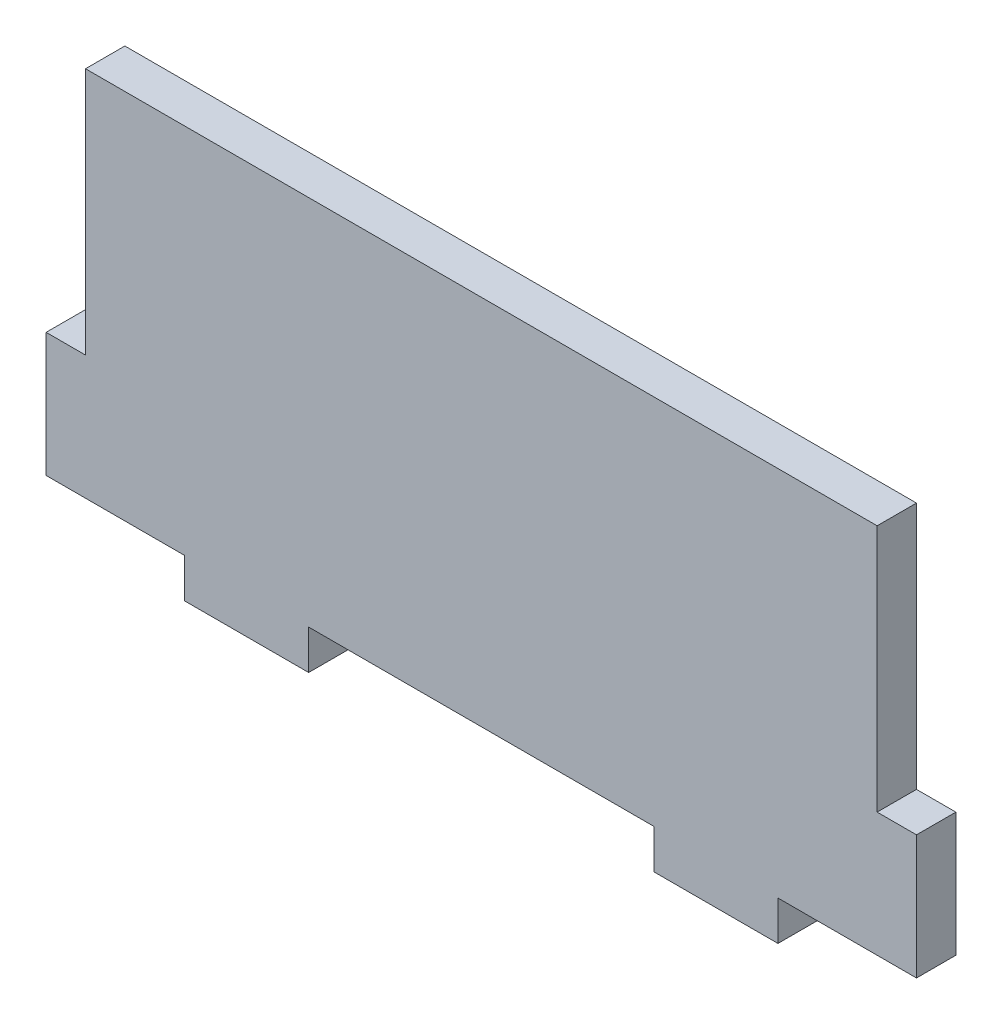
ISO-10303-21;
HEADER;
FILE_DESCRIPTION(('STEP AP214'),'2;1');
FILE_NAME('part.step','',(''),(''),'','','');
FILE_SCHEMA(('AUTOMOTIVE_DESIGN { 1 0 10303 214 1 1 1 1 }'));
ENDSEC;
DATA;
#1=APPLICATION_CONTEXT('core data for automotive mechanical design processes');
#2=APPLICATION_PROTOCOL_DEFINITION('international standard','automotive_design',2000,#1);
#3=PRODUCT_CONTEXT('',#1,'mechanical');
#4=PRODUCT('Part','Part','',(#3));
#5=PRODUCT_RELATED_PRODUCT_CATEGORY('part','',(#4));
#6=PRODUCT_DEFINITION_FORMATION('','',#4);
#7=PRODUCT_DEFINITION_CONTEXT('part definition',#1,'design');
#8=PRODUCT_DEFINITION('design','',#6,#7);
#9=PRODUCT_DEFINITION_SHAPE('','',#8);
#10=(LENGTH_UNIT() NAMED_UNIT(*) SI_UNIT(.MILLI.,.METRE.));
#11=(NAMED_UNIT(*) PLANE_ANGLE_UNIT() SI_UNIT($,.RADIAN.));
#12=(NAMED_UNIT(*) SI_UNIT($,.STERADIAN.) SOLID_ANGLE_UNIT());
#13=UNCERTAINTY_MEASURE_WITH_UNIT(LENGTH_MEASURE(1.E-05),#10,'distance_accuracy_value','');
#14=(GEOMETRIC_REPRESENTATION_CONTEXT(3) GLOBAL_UNCERTAINTY_ASSIGNED_CONTEXT((#13)) GLOBAL_UNIT_ASSIGNED_CONTEXT((#10,
#11,#12)) REPRESENTATION_CONTEXT('',''));
#15=CARTESIAN_POINT('',(0.,0.,0.));
#16=DIRECTION('',(0.,0.,1.));
#17=DIRECTION('',(1.,0.,0.));
#18=AXIS2_PLACEMENT_3D('',#15,#16,#17);
#19=CARTESIAN_POINT('',(0.,-60.,12.7));
#20=DIRECTION('',(0.,1.,0.));
#21=DIRECTION('',(0.,0.,1.));
#22=AXIS2_PLACEMENT_3D('',#19,#20,#21);
#23=PLANE('',#22);
#24=DIRECTION('',(1.,0.,0.));
#25=VECTOR('',#24,1.);
#26=CARTESIAN_POINT('',(0.,-60.,0.));
#27=LINE('',#26,#25);
#28=CARTESIAN_POINT('',(-140.4,-60.,0.));
#29=VERTEX_POINT('',#28);
#30=CARTESIAN_POINT('',(-95.7,-60.,0.));
#31=VERTEX_POINT('',#30);
#32=EDGE_CURVE('E188',#29,#31,#27,.T.);
#33=ORIENTED_EDGE('',*,*,#32,.T.);
#34=DIRECTION('',(0.,0.,-1.));
#35=VECTOR('',#34,1.);
#36=CARTESIAN_POINT('',(-95.7,-60.,12.7));
#37=LINE('',#36,#35);
#38=CARTESIAN_POINT('',(-95.7,-60.,12.7));
#39=VERTEX_POINT('',#38);
#40=EDGE_CURVE('E11',#39,#31,#37,.T.);
#41=ORIENTED_EDGE('',*,*,#40,.F.);
#42=DIRECTION('',(1.,0.,0.));
#43=VECTOR('',#42,1.);
#44=CARTESIAN_POINT('',(0.,-60.,12.7));
#45=LINE('',#44,#43);
#46=CARTESIAN_POINT('',(-140.4,-60.,12.7));
#47=VERTEX_POINT('',#46);
#48=EDGE_CURVE('E228',#47,#39,#45,.T.);
#49=ORIENTED_EDGE('',*,*,#48,.F.);
#50=DIRECTION('',(0.,0.,-1.));
#51=VECTOR('',#50,1.);
#52=CARTESIAN_POINT('',(-140.4,-60.,12.7));
#53=LINE('',#52,#51);
#54=EDGE_CURVE('E58',#47,#29,#53,.T.);
#55=ORIENTED_EDGE('',*,*,#54,.T.);
#56=EDGE_LOOP('',(#33,#41,#49,#55));
#57=FACE_BOUND('',#56,.T.);
#58=ADVANCED_FACE('F41',(#57),#23,.F.);
#59=CARTESIAN_POINT('',(-95.7,0.,12.7));
#60=DIRECTION('',(1.,0.,0.));
#61=DIRECTION('',(0.,0.,-1.));
#62=AXIS2_PLACEMENT_3D('',#59,#60,#61);
#63=PLANE('',#62);
#64=DIRECTION('',(0.,-1.,0.));
#65=VECTOR('',#64,1.);
#66=CARTESIAN_POINT('',(-95.7,0.,0.));
#67=LINE('',#66,#65);
#68=CARTESIAN_POINT('',(-95.7,-72.7,0.));
#69=VERTEX_POINT('',#68);
#70=EDGE_CURVE('E190',#31,#69,#67,.T.);
#71=ORIENTED_EDGE('',*,*,#70,.T.);
#72=DIRECTION('',(0.,0.,-1.));
#73=VECTOR('',#72,1.);
#74=CARTESIAN_POINT('',(-95.7,-72.7,12.7));
#75=LINE('',#74,#73);
#76=CARTESIAN_POINT('',(-95.7,-72.7,12.7));
#77=VERTEX_POINT('',#76);
#78=EDGE_CURVE('E50',#77,#69,#75,.T.);
#79=ORIENTED_EDGE('',*,*,#78,.F.);
#80=DIRECTION('',(0.,-1.,0.));
#81=VECTOR('',#80,1.);
#82=CARTESIAN_POINT('',(-95.7,0.,12.7));
#83=LINE('',#82,#81);
#84=EDGE_CURVE('E121',#39,#77,#83,.T.);
#85=ORIENTED_EDGE('',*,*,#84,.F.);
#86=ORIENTED_EDGE('',*,*,#40,.T.);
#87=EDGE_LOOP('',(#71,#79,#85,#86));
#88=FACE_BOUND('',#87,.T.);
#89=ADVANCED_FACE('F43',(#88),#63,.F.);
#90=CARTESIAN_POINT('',(0.,-72.7,12.7));
#91=DIRECTION('',(0.,1.,0.));
#92=DIRECTION('',(0.,0.,1.));
#93=AXIS2_PLACEMENT_3D('',#90,#91,#92);
#94=PLANE('',#93);
#95=DIRECTION('',(1.,0.,0.));
#96=VECTOR('',#95,1.);
#97=CARTESIAN_POINT('',(0.,-72.7,0.));
#98=LINE('',#97,#96);
#99=CARTESIAN_POINT('',(-55.7,-72.7,0.));
#100=VERTEX_POINT('',#99);
#101=EDGE_CURVE('E193',#69,#100,#98,.T.);
#102=ORIENTED_EDGE('',*,*,#101,.T.);
#103=DIRECTION('',(0.,0.,-1.));
#104=VECTOR('',#103,1.);
#105=CARTESIAN_POINT('',(-55.7,-72.7,12.7));
#106=LINE('',#105,#104);
#107=CARTESIAN_POINT('',(-55.7,-72.7,12.7));
#108=VERTEX_POINT('',#107);
#109=EDGE_CURVE('E252',#108,#100,#106,.T.);
#110=ORIENTED_EDGE('',*,*,#109,.F.);
#111=DIRECTION('',(1.,0.,0.));
#112=VECTOR('',#111,1.);
#113=CARTESIAN_POINT('',(0.,-72.7,12.7));
#114=LINE('',#113,#112);
#115=EDGE_CURVE('E259',#77,#108,#114,.T.);
#116=ORIENTED_EDGE('',*,*,#115,.F.);
#117=ORIENTED_EDGE('',*,*,#78,.T.);
#118=EDGE_LOOP('',(#102,#110,#116,#117));
#119=FACE_BOUND('',#118,.T.);
#120=ADVANCED_FACE('F257',(#119),#94,.F.);
#121=CARTESIAN_POINT('',(-55.7,0.,12.7));
#122=DIRECTION('',(1.,0.,0.));
#123=DIRECTION('',(0.,0.,-1.));
#124=AXIS2_PLACEMENT_3D('',#121,#122,#123);
#125=PLANE('',#124);
#126=DIRECTION('',(0.,-1.,0.));
#127=VECTOR('',#126,1.);
#128=CARTESIAN_POINT('',(-55.7,0.,0.));
#129=LINE('',#128,#127);
#130=CARTESIAN_POINT('',(-55.7,-60.,0.));
#131=VERTEX_POINT('',#130);
#132=EDGE_CURVE('E196',#131,#100,#129,.T.);
#133=ORIENTED_EDGE('',*,*,#132,.F.);
#134=DIRECTION('',(0.,0.,-1.));
#135=VECTOR('',#134,1.);
#136=CARTESIAN_POINT('',(-55.7,-60.,12.7));
#137=LINE('',#136,#135);
#138=CARTESIAN_POINT('',(-55.7,-60.,12.7));
#139=VERTEX_POINT('',#138);
#140=EDGE_CURVE('E250',#139,#131,#137,.T.);
#141=ORIENTED_EDGE('',*,*,#140,.F.);
#142=DIRECTION('',(0.,-1.,0.));
#143=VECTOR('',#142,1.);
#144=CARTESIAN_POINT('',(-55.7,0.,12.7));
#145=LINE('',#144,#143);
#146=EDGE_CURVE('E270',#139,#108,#145,.T.);
#147=ORIENTED_EDGE('',*,*,#146,.T.);
#148=ORIENTED_EDGE('',*,*,#109,.T.);
#149=EDGE_LOOP('',(#133,#141,#147,#148));
#150=FACE_BOUND('',#149,.T.);
#151=ADVANCED_FACE('F266',(#150),#125,.T.);
#152=CARTESIAN_POINT('',(55.7,-60.,0.));
#153=VERTEX_POINT('',#152);
#154=EDGE_CURVE('E191',#131,#153,#27,.T.);
#155=ORIENTED_EDGE('',*,*,#154,.T.);
#156=DIRECTION('',(0.,0.,-1.));
#157=VECTOR('',#156,1.);
#158=CARTESIAN_POINT('',(55.7,-60.,12.7));
#159=LINE('',#158,#157);
#160=CARTESIAN_POINT('',(55.7,-60.,12.7));
#161=VERTEX_POINT('',#160);
#162=EDGE_CURVE('E247',#161,#153,#159,.T.);
#163=ORIENTED_EDGE('',*,*,#162,.F.);
#164=EDGE_CURVE('E271',#139,#161,#45,.T.);
#165=ORIENTED_EDGE('',*,*,#164,.F.);
#166=ORIENTED_EDGE('',*,*,#140,.T.);
#167=EDGE_LOOP('',(#155,#163,#165,#166));
#168=FACE_BOUND('',#167,.T.);
#169=ADVANCED_FACE('F312',(#168),#23,.F.);
#170=CARTESIAN_POINT('',(55.7,0.,12.7));
#171=DIRECTION('',(1.,0.,0.));
#172=DIRECTION('',(0.,0.,-1.));
#173=AXIS2_PLACEMENT_3D('',#170,#171,#172);
#174=PLANE('',#173);
#175=DIRECTION('',(0.,-1.,0.));
#176=VECTOR('',#175,1.);
#177=CARTESIAN_POINT('',(55.7,0.,0.));
#178=LINE('',#177,#176);
#179=CARTESIAN_POINT('',(55.7,-72.7,0.));
#180=VERTEX_POINT('',#179);
#181=EDGE_CURVE('E199',#153,#180,#178,.T.);
#182=ORIENTED_EDGE('',*,*,#181,.T.);
#183=DIRECTION('',(0.,0.,-1.));
#184=VECTOR('',#183,1.);
#185=CARTESIAN_POINT('',(55.7,-72.7,12.7));
#186=LINE('',#185,#184);
#187=CARTESIAN_POINT('',(55.7,-72.7,12.7));
#188=VERTEX_POINT('',#187);
#189=EDGE_CURVE('E245',#188,#180,#186,.T.);
#190=ORIENTED_EDGE('',*,*,#189,.F.);
#191=DIRECTION('',(0.,-1.,0.));
#192=VECTOR('',#191,1.);
#193=CARTESIAN_POINT('',(55.7,0.,12.7));
#194=LINE('',#193,#192);
#195=EDGE_CURVE('E273',#161,#188,#194,.T.);
#196=ORIENTED_EDGE('',*,*,#195,.F.);
#197=ORIENTED_EDGE('',*,*,#162,.T.);
#198=EDGE_LOOP('',(#182,#190,#196,#197));
#199=FACE_BOUND('',#198,.T.);
#200=ADVANCED_FACE('F319',(#199),#174,.F.);
#201=CARTESIAN_POINT('',(0.,-72.7,12.7));
#202=DIRECTION('',(0.,-1.,0.));
#203=DIRECTION('',(0.,0.,-1.));
#204=AXIS2_PLACEMENT_3D('',#201,#202,#203);
#205=PLANE('',#204);
#206=DIRECTION('',(-1.,0.,0.));
#207=VECTOR('',#206,1.);
#208=CARTESIAN_POINT('',(0.,-72.7,0.));
#209=LINE('',#208,#207);
#210=CARTESIAN_POINT('',(95.7,-72.7,0.));
#211=VERTEX_POINT('',#210);
#212=EDGE_CURVE('E202',#211,#180,#209,.T.);
#213=ORIENTED_EDGE('',*,*,#212,.F.);
#214=DIRECTION('',(0.,0.,-1.));
#215=VECTOR('',#214,1.);
#216=CARTESIAN_POINT('',(95.7,-72.7,12.7));
#217=LINE('',#216,#215);
#218=CARTESIAN_POINT('',(95.7,-72.7,12.7));
#219=VERTEX_POINT('',#218);
#220=EDGE_CURVE('E243',#219,#211,#217,.T.);
#221=ORIENTED_EDGE('',*,*,#220,.F.);
#222=DIRECTION('',(-1.,0.,0.));
#223=VECTOR('',#222,1.);
#224=CARTESIAN_POINT('',(0.,-72.7,12.7));
#225=LINE('',#224,#223);
#226=EDGE_CURVE('E279',#219,#188,#225,.T.);
#227=ORIENTED_EDGE('',*,*,#226,.T.);
#228=ORIENTED_EDGE('',*,*,#189,.T.);
#229=EDGE_LOOP('',(#213,#221,#227,#228));
#230=FACE_BOUND('',#229,.T.);
#231=ADVANCED_FACE('F325',(#230),#205,.T.);
#232=CARTESIAN_POINT('',(95.7,0.,12.7));
#233=DIRECTION('',(1.,0.,0.));
#234=DIRECTION('',(0.,0.,-1.));
#235=AXIS2_PLACEMENT_3D('',#232,#233,#234);
#236=PLANE('',#235);
#237=DIRECTION('',(0.,-1.,0.));
#238=VECTOR('',#237,1.);
#239=CARTESIAN_POINT('',(95.7,0.,0.));
#240=LINE('',#239,#238);
#241=CARTESIAN_POINT('',(95.7,-60.,0.));
#242=VERTEX_POINT('',#241);
#243=EDGE_CURVE('E205',#242,#211,#240,.T.);
#244=ORIENTED_EDGE('',*,*,#243,.F.);
#245=DIRECTION('',(0.,0.,-1.));
#246=VECTOR('',#245,1.);
#247=CARTESIAN_POINT('',(95.7,-60.,12.7));
#248=LINE('',#247,#246);
#249=CARTESIAN_POINT('',(95.7,-60.,12.7));
#250=VERTEX_POINT('',#249);
#251=EDGE_CURVE('E241',#250,#242,#248,.T.);
#252=ORIENTED_EDGE('',*,*,#251,.F.);
#253=DIRECTION('',(0.,-1.,0.));
#254=VECTOR('',#253,1.);
#255=CARTESIAN_POINT('',(95.7,0.,12.7));
#256=LINE('',#255,#254);
#257=EDGE_CURVE('E282',#250,#219,#256,.T.);
#258=ORIENTED_EDGE('',*,*,#257,.T.);
#259=ORIENTED_EDGE('',*,*,#220,.T.);
#260=EDGE_LOOP('',(#244,#252,#258,#259));
#261=FACE_BOUND('',#260,.T.);
#262=ADVANCED_FACE('F337',(#261),#236,.T.);
#263=CARTESIAN_POINT('',(0.,-60.,12.7));
#264=DIRECTION('',(0.,1.,0.));
#265=DIRECTION('',(0.,0.,1.));
#266=AXIS2_PLACEMENT_3D('',#263,#264,#265);
#267=PLANE('',#266);
#268=DIRECTION('',(1.,0.,0.));
#269=VECTOR('',#268,1.);
#270=CARTESIAN_POINT('',(0.,-60.,0.));
#271=LINE('',#270,#269);
#272=CARTESIAN_POINT('',(140.4,-60.,0.));
#273=VERTEX_POINT('',#272);
#274=EDGE_CURVE('E208',#242,#273,#271,.T.);
#275=ORIENTED_EDGE('',*,*,#274,.T.);
#276=DIRECTION('',(0.,0.,-1.));
#277=VECTOR('',#276,1.);
#278=CARTESIAN_POINT('',(140.4,-60.,12.7));
#279=LINE('',#278,#277);
#280=CARTESIAN_POINT('',(140.4,-60.,12.7));
#281=VERTEX_POINT('',#280);
#282=EDGE_CURVE('E238',#281,#273,#279,.T.);
#283=ORIENTED_EDGE('',*,*,#282,.F.);
#284=DIRECTION('',(1.,0.,0.));
#285=VECTOR('',#284,1.);
#286=CARTESIAN_POINT('',(0.,-60.,12.7));
#287=LINE('',#286,#285);
#288=EDGE_CURVE('E285',#250,#281,#287,.T.);
#289=ORIENTED_EDGE('',*,*,#288,.F.);
#290=ORIENTED_EDGE('',*,*,#251,.T.);
#291=EDGE_LOOP('',(#275,#283,#289,#290));
#292=FACE_BOUND('',#291,.T.);
#293=ADVANCED_FACE('F341',(#292),#267,.F.);
#294=CARTESIAN_POINT('',(140.4,0.,12.7));
#295=DIRECTION('',(-1.,0.,0.));
#296=DIRECTION('',(0.,0.,1.));
#297=AXIS2_PLACEMENT_3D('',#294,#295,#296);
#298=PLANE('',#297);
#299=DIRECTION('',(0.,1.,0.));
#300=VECTOR('',#299,1.);
#301=CARTESIAN_POINT('',(140.4,0.,0.));
#302=LINE('',#301,#300);
#303=CARTESIAN_POINT('',(140.4,-20.,0.));
#304=VERTEX_POINT('',#303);
#305=EDGE_CURVE('E210',#273,#304,#302,.T.);
#306=ORIENTED_EDGE('',*,*,#305,.T.);
#307=DIRECTION('',(0.,0.,-1.));
#308=VECTOR('',#307,1.);
#309=CARTESIAN_POINT('',(140.4,-20.,12.7));
#310=LINE('',#309,#308);
#311=CARTESIAN_POINT('',(140.4,-20.,12.7));
#312=VERTEX_POINT('',#311);
#313=EDGE_CURVE('E236',#312,#304,#310,.T.);
#314=ORIENTED_EDGE('',*,*,#313,.F.);
#315=DIRECTION('',(0.,1.,0.));
#316=VECTOR('',#315,1.);
#317=CARTESIAN_POINT('',(140.4,0.,12.7));
#318=LINE('',#317,#316);
#319=EDGE_CURVE('E287',#281,#312,#318,.T.);
#320=ORIENTED_EDGE('',*,*,#319,.F.);
#321=ORIENTED_EDGE('',*,*,#282,.T.);
#322=EDGE_LOOP('',(#306,#314,#320,#321));
#323=FACE_BOUND('',#322,.T.);
#324=ADVANCED_FACE('F345',(#323),#298,.F.);
#325=CARTESIAN_POINT('',(0.,-20.,12.7));
#326=DIRECTION('',(0.,1.,0.));
#327=DIRECTION('',(0.,0.,1.));
#328=AXIS2_PLACEMENT_3D('',#325,#326,#327);
#329=PLANE('',#328);
#330=DIRECTION('',(1.,0.,0.));
#331=VECTOR('',#330,1.);
#332=CARTESIAN_POINT('',(0.,-20.,0.));
#333=LINE('',#332,#331);
#334=CARTESIAN_POINT('',(127.7,-20.,0.));
#335=VERTEX_POINT('',#334);
#336=EDGE_CURVE('E213',#335,#304,#333,.T.);
#337=ORIENTED_EDGE('',*,*,#336,.F.);
#338=DIRECTION('',(0.,0.,-1.));
#339=VECTOR('',#338,1.);
#340=CARTESIAN_POINT('',(127.7,-20.,12.7));
#341=LINE('',#340,#339);
#342=CARTESIAN_POINT('',(127.7,-20.,12.7));
#343=VERTEX_POINT('',#342);
#344=EDGE_CURVE('E234',#343,#335,#341,.T.);
#345=ORIENTED_EDGE('',*,*,#344,.F.);
#346=DIRECTION('',(1.,0.,0.));
#347=VECTOR('',#346,1.);
#348=CARTESIAN_POINT('',(0.,-20.,12.7));
#349=LINE('',#348,#347);
#350=EDGE_CURVE('E289',#343,#312,#349,.T.);
#351=ORIENTED_EDGE('',*,*,#350,.T.);
#352=ORIENTED_EDGE('',*,*,#313,.T.);
#353=EDGE_LOOP('',(#337,#345,#351,#352));
#354=FACE_BOUND('',#353,.T.);
#355=ADVANCED_FACE('F349',(#354),#329,.T.);
#356=CARTESIAN_POINT('',(127.7,0.,12.7));
#357=DIRECTION('',(-1.,0.,0.));
#358=DIRECTION('',(0.,0.,1.));
#359=AXIS2_PLACEMENT_3D('',#356,#357,#358);
#360=PLANE('',#359);
#361=DIRECTION('',(0.,1.,0.));
#362=VECTOR('',#361,1.);
#363=CARTESIAN_POINT('',(127.7,0.,0.));
#364=LINE('',#363,#362);
#365=CARTESIAN_POINT('',(127.7,60.,0.));
#366=VERTEX_POINT('',#365);
#367=EDGE_CURVE('E216',#335,#366,#364,.T.);
#368=ORIENTED_EDGE('',*,*,#367,.T.);
#369=DIRECTION('',(0.,0.,-1.));
#370=VECTOR('',#369,1.);
#371=CARTESIAN_POINT('',(127.7,60.,12.7));
#372=LINE('',#371,#370);
#373=CARTESIAN_POINT('',(127.7,60.,12.7));
#374=VERTEX_POINT('',#373);
#375=EDGE_CURVE('E232',#374,#366,#372,.T.);
#376=ORIENTED_EDGE('',*,*,#375,.F.);
#377=DIRECTION('',(0.,1.,0.));
#378=VECTOR('',#377,1.);
#379=CARTESIAN_POINT('',(127.7,0.,12.7));
#380=LINE('',#379,#378);
#381=EDGE_CURVE('E183',#343,#374,#380,.T.);
#382=ORIENTED_EDGE('',*,*,#381,.F.);
#383=ORIENTED_EDGE('',*,*,#344,.T.);
#384=EDGE_LOOP('',(#368,#376,#382,#383));
#385=FACE_BOUND('',#384,.T.);
#386=ADVANCED_FACE('F295',(#385),#360,.F.);
#387=CARTESIAN_POINT('',(0.,60.,12.7));
#388=DIRECTION('',(0.,1.,0.));
#389=DIRECTION('',(0.,0.,1.));
#390=AXIS2_PLACEMENT_3D('',#387,#388,#389);
#391=PLANE('',#390);
#392=DIRECTION('',(1.,0.,0.));
#393=VECTOR('',#392,1.);
#394=CARTESIAN_POINT('',(0.,60.,0.));
#395=LINE('',#394,#393);
#396=CARTESIAN_POINT('',(-127.7,60.,0.));
#397=VERTEX_POINT('',#396);
#398=EDGE_CURVE('E219',#397,#366,#395,.T.);
#399=ORIENTED_EDGE('',*,*,#398,.F.);
#400=DIRECTION('',(0.,0.,-1.));
#401=VECTOR('',#400,1.);
#402=CARTESIAN_POINT('',(-127.7,60.,12.7));
#403=LINE('',#402,#401);
#404=CARTESIAN_POINT('',(-127.7,60.,12.7));
#405=VERTEX_POINT('',#404);
#406=EDGE_CURVE('E170',#405,#397,#403,.T.);
#407=ORIENTED_EDGE('',*,*,#406,.F.);
#408=DIRECTION('',(1.,0.,0.));
#409=VECTOR('',#408,1.);
#410=CARTESIAN_POINT('',(0.,60.,12.7));
#411=LINE('',#410,#409);
#412=EDGE_CURVE('E181',#405,#374,#411,.T.);
#413=ORIENTED_EDGE('',*,*,#412,.T.);
#414=ORIENTED_EDGE('',*,*,#375,.T.);
#415=EDGE_LOOP('',(#399,#407,#413,#414));
#416=FACE_BOUND('',#415,.T.);
#417=ADVANCED_FACE('F299',(#416),#391,.T.);
#418=CARTESIAN_POINT('',(-127.7,0.,12.7));
#419=DIRECTION('',(-1.,0.,0.));
#420=DIRECTION('',(0.,0.,1.));
#421=AXIS2_PLACEMENT_3D('',#418,#419,#420);
#422=PLANE('',#421);
#423=DIRECTION('',(0.,1.,0.));
#424=VECTOR('',#423,1.);
#425=CARTESIAN_POINT('',(-127.7,0.,0.));
#426=LINE('',#425,#424);
#427=CARTESIAN_POINT('',(-127.7,-20.,0.));
#428=VERTEX_POINT('',#427);
#429=EDGE_CURVE('E167',#428,#397,#426,.T.);
#430=ORIENTED_EDGE('',*,*,#429,.F.);
#431=DIRECTION('',(0.,0.,-1.));
#432=VECTOR('',#431,1.);
#433=CARTESIAN_POINT('',(-127.7,-20.,12.7));
#434=LINE('',#433,#432);
#435=CARTESIAN_POINT('',(-127.7,-20.,12.7));
#436=VERTEX_POINT('',#435);
#437=EDGE_CURVE('E161',#436,#428,#434,.T.);
#438=ORIENTED_EDGE('',*,*,#437,.F.);
#439=DIRECTION('',(0.,1.,0.));
#440=VECTOR('',#439,1.);
#441=CARTESIAN_POINT('',(-127.7,0.,12.7));
#442=LINE('',#441,#440);
#443=EDGE_CURVE('E165',#436,#405,#442,.T.);
#444=ORIENTED_EDGE('',*,*,#443,.T.);
#445=ORIENTED_EDGE('',*,*,#406,.T.);
#446=EDGE_LOOP('',(#430,#438,#444,#445));
#447=FACE_BOUND('',#446,.T.);
#448=ADVANCED_FACE('F163',(#447),#422,.T.);
#449=CARTESIAN_POINT('',(0.,-20.,12.7));
#450=DIRECTION('',(0.,-1.,0.));
#451=DIRECTION('',(0.,0.,-1.));
#452=AXIS2_PLACEMENT_3D('',#449,#450,#451);
#453=PLANE('',#452);
#454=DIRECTION('',(-1.,0.,0.));
#455=VECTOR('',#454,1.);
#456=CARTESIAN_POINT('',(0.,-20.,0.));
#457=LINE('',#456,#455);
#458=CARTESIAN_POINT('',(-140.4,-20.,0.));
#459=VERTEX_POINT('',#458);
#460=EDGE_CURVE('E223',#428,#459,#457,.T.);
#461=ORIENTED_EDGE('',*,*,#460,.T.);
#462=DIRECTION('',(0.,0.,-1.));
#463=VECTOR('',#462,1.);
#464=CARTESIAN_POINT('',(-140.4,-20.,12.7));
#465=LINE('',#464,#463);
#466=CARTESIAN_POINT('',(-140.4,-20.,12.7));
#467=VERTEX_POINT('',#466);
#468=EDGE_CURVE('E109',#467,#459,#465,.T.);
#469=ORIENTED_EDGE('',*,*,#468,.F.);
#470=DIRECTION('',(-1.,0.,0.));
#471=VECTOR('',#470,1.);
#472=CARTESIAN_POINT('',(0.,-20.,12.7));
#473=LINE('',#472,#471);
#474=EDGE_CURVE('E172',#436,#467,#473,.T.);
#475=ORIENTED_EDGE('',*,*,#474,.F.);
#476=ORIENTED_EDGE('',*,*,#437,.T.);
#477=EDGE_LOOP('',(#461,#469,#475,#476));
#478=FACE_BOUND('',#477,.T.);
#479=ADVANCED_FACE('F173',(#478),#453,.F.);
#480=CARTESIAN_POINT('',(-140.4,0.,12.7));
#481=DIRECTION('',(-1.,0.,0.));
#482=DIRECTION('',(0.,0.,1.));
#483=AXIS2_PLACEMENT_3D('',#480,#481,#482);
#484=PLANE('',#483);
#485=DIRECTION('',(0.,1.,0.));
#486=VECTOR('',#485,1.);
#487=CARTESIAN_POINT('',(-140.4,0.,0.));
#488=LINE('',#487,#486);
#489=EDGE_CURVE('E225',#29,#459,#488,.T.);
#490=ORIENTED_EDGE('',*,*,#489,.F.);
#491=ORIENTED_EDGE('',*,*,#54,.F.);
#492=DIRECTION('',(0.,1.,0.));
#493=VECTOR('',#492,1.);
#494=CARTESIAN_POINT('',(-140.4,0.,12.7));
#495=LINE('',#494,#493);
#496=EDGE_CURVE('E176',#47,#467,#495,.T.);
#497=ORIENTED_EDGE('',*,*,#496,.T.);
#498=ORIENTED_EDGE('',*,*,#468,.T.);
#499=EDGE_LOOP('',(#490,#491,#497,#498));
#500=FACE_BOUND('',#499,.T.);
#501=ADVANCED_FACE('F300',(#500),#484,.T.);
#502=CARTESIAN_POINT('',(0.,0.,12.7));
#503=DIRECTION('',(0.,0.,1.));
#504=DIRECTION('',(1.,0.,0.));
#505=AXIS2_PLACEMENT_3D('',#502,#503,#504);
#506=PLANE('',#505);
#507=ORIENTED_EDGE('',*,*,#48,.T.);
#508=ORIENTED_EDGE('',*,*,#84,.T.);
#509=ORIENTED_EDGE('',*,*,#115,.T.);
#510=ORIENTED_EDGE('',*,*,#146,.F.);
#511=ORIENTED_EDGE('',*,*,#164,.T.);
#512=ORIENTED_EDGE('',*,*,#195,.T.);
#513=ORIENTED_EDGE('',*,*,#226,.F.);
#514=ORIENTED_EDGE('',*,*,#257,.F.);
#515=ORIENTED_EDGE('',*,*,#288,.T.);
#516=ORIENTED_EDGE('',*,*,#319,.T.);
#517=ORIENTED_EDGE('',*,*,#350,.F.);
#518=ORIENTED_EDGE('',*,*,#381,.T.);
#519=ORIENTED_EDGE('',*,*,#412,.F.);
#520=ORIENTED_EDGE('',*,*,#443,.F.);
#521=ORIENTED_EDGE('',*,*,#474,.T.);
#522=ORIENTED_EDGE('',*,*,#496,.F.);
#523=EDGE_LOOP('',(#507,#508,#509,#510,#511,#512,#513,#514,#515,#516,#517,#518,#519,#520,#521,#522));
#524=FACE_BOUND('',#523,.T.);
#525=ADVANCED_FACE('F179',(#524),#506,.T.);
#526=CARTESIAN_POINT('',(0.,0.,0.));
#527=DIRECTION('',(0.,0.,1.));
#528=DIRECTION('',(1.,0.,0.));
#529=AXIS2_PLACEMENT_3D('',#526,#527,#528);
#530=PLANE('',#529);
#531=ORIENTED_EDGE('',*,*,#32,.F.);
#532=ORIENTED_EDGE('',*,*,#489,.T.);
#533=ORIENTED_EDGE('',*,*,#460,.F.);
#534=ORIENTED_EDGE('',*,*,#429,.T.);
#535=ORIENTED_EDGE('',*,*,#398,.T.);
#536=ORIENTED_EDGE('',*,*,#367,.F.);
#537=ORIENTED_EDGE('',*,*,#336,.T.);
#538=ORIENTED_EDGE('',*,*,#305,.F.);
#539=ORIENTED_EDGE('',*,*,#274,.F.);
#540=ORIENTED_EDGE('',*,*,#243,.T.);
#541=ORIENTED_EDGE('',*,*,#212,.T.);
#542=ORIENTED_EDGE('',*,*,#181,.F.);
#543=ORIENTED_EDGE('',*,*,#154,.F.);
#544=ORIENTED_EDGE('',*,*,#132,.T.);
#545=ORIENTED_EDGE('',*,*,#101,.F.);
#546=ORIENTED_EDGE('',*,*,#70,.F.);
#547=EDGE_LOOP('',(#531,#532,#533,#534,#535,#536,#537,#538,#539,#540,#541,#542,#543,#544,#545,#546));
#548=FACE_BOUND('',#547,.T.);
#549=ADVANCED_FACE('F261',(#548),#530,.F.);
#550=CLOSED_SHELL('',(#58,#89,#120,#151,#169,#200,#231,#262,#293,#324,#355,#386,#417,#448,#479,
#501,#525,#549));
#551=MANIFOLD_SOLID_BREP('B2',#550);
#552=ADVANCED_BREP_SHAPE_REPRESENTATION('',(#18,#551),#14);
#553=SHAPE_DEFINITION_REPRESENTATION(#9,#552);
ENDSEC;
END-ISO-10303-21;
